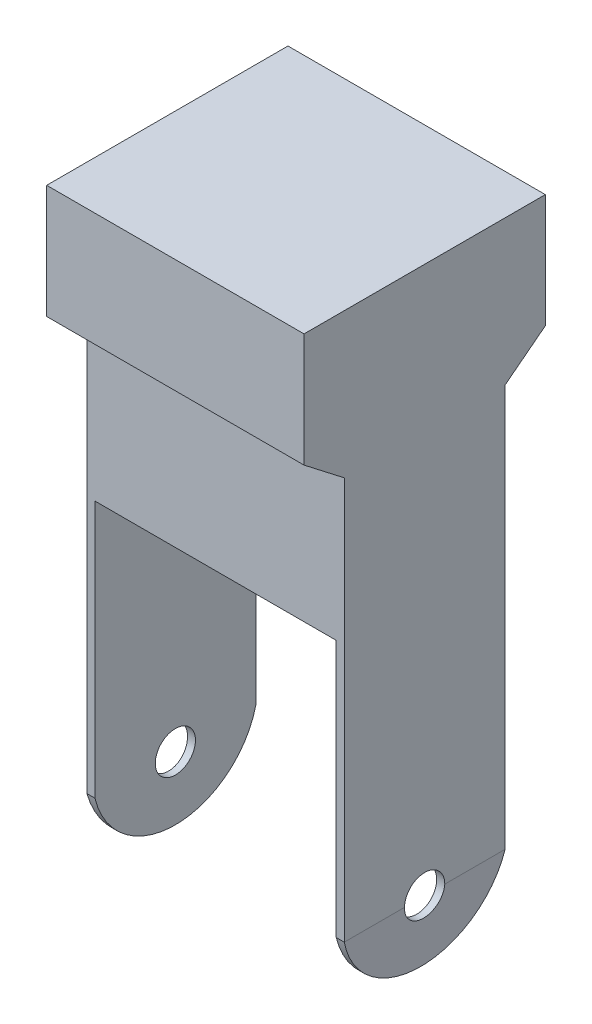
ISO-10303-21;
HEADER;
FILE_DESCRIPTION(('STEP AP214'),'2;1');
FILE_NAME('part.step','',(''),(''),'','','');
FILE_SCHEMA(('AUTOMOTIVE_DESIGN { 1 0 10303 214 1 1 1 1 }'));
ENDSEC;
DATA;
#1=APPLICATION_CONTEXT('core data for automotive mechanical design processes');
#2=APPLICATION_PROTOCOL_DEFINITION('international standard','automotive_design',2000,#1);
#3=PRODUCT_CONTEXT('',#1,'mechanical');
#4=PRODUCT('Part','Part','',(#3));
#5=PRODUCT_RELATED_PRODUCT_CATEGORY('part','',(#4));
#6=PRODUCT_DEFINITION_FORMATION('','',#4);
#7=PRODUCT_DEFINITION_CONTEXT('part definition',#1,'design');
#8=PRODUCT_DEFINITION('design','',#6,#7);
#9=PRODUCT_DEFINITION_SHAPE('','',#8);
#10=(LENGTH_UNIT() NAMED_UNIT(*) SI_UNIT(.MILLI.,.METRE.));
#11=(NAMED_UNIT(*) PLANE_ANGLE_UNIT() SI_UNIT($,.RADIAN.));
#12=(NAMED_UNIT(*) SI_UNIT($,.STERADIAN.) SOLID_ANGLE_UNIT());
#13=UNCERTAINTY_MEASURE_WITH_UNIT(LENGTH_MEASURE(1.E-05),#10,'distance_accuracy_value','');
#14=(GEOMETRIC_REPRESENTATION_CONTEXT(3) GLOBAL_UNCERTAINTY_ASSIGNED_CONTEXT((#13)) GLOBAL_UNIT_ASSIGNED_CONTEXT((#10,
#11,#12)) REPRESENTATION_CONTEXT('',''));
#15=CARTESIAN_POINT('',(0.,0.,0.));
#16=DIRECTION('',(0.,0.,1.));
#17=DIRECTION('',(1.,0.,0.));
#18=AXIS2_PLACEMENT_3D('',#15,#16,#17);
#19=CARTESIAN_POINT('',(15.5,-8.,15.));
#20=DIRECTION('',(-0.998052578482889,0.0623782861551806,0.));
#21=DIRECTION('',(-0.0623782861551806,-0.998052578482889,0.));
#22=AXIS2_PLACEMENT_3D('',#19,#20,#21);
#23=PLANE('',#22);
#24=DIRECTION('',(0.,0.,-1.));
#25=VECTOR('',#24,1.);
#26=CARTESIAN_POINT('',(16.,0.,15.));
#27=LINE('',#26,#25);
#28=CARTESIAN_POINT('',(16.,0.,10.));
#29=VERTEX_POINT('',#28);
#30=CARTESIAN_POINT('',(16.,0.,2.5));
#31=VERTEX_POINT('',#30);
#32=EDGE_CURVE('E212',#29,#31,#27,.T.);
#33=ORIENTED_EDGE('',*,*,#32,.F.);
#34=CARTESIAN_POINT('',(16.1507547878053,2.41207660488458,0.));
#35=DIRECTION('',(-0.998052578482889,0.0623782861551806,0.));
#36=DIRECTION('',(-0.0623782861551806,-0.998052578482889,0.));
#37=AXIS2_PLACEMENT_3D('',#34,#35,#36);
#38=ELLIPSE('',#37,10.3068649721376,10.2867931615169);
#39=CARTESIAN_POINT('',(16.,0.,-10.));
#40=VERTEX_POINT('',#39);
#41=EDGE_CURVE('E333',#29,#40,#38,.F.);
#42=ORIENTED_EDGE('',*,*,#41,.T.);
#43=CARTESIAN_POINT('',(16.,0.,-2.5));
#44=VERTEX_POINT('',#43);
#45=EDGE_CURVE('E208',#44,#40,#27,.T.);
#46=ORIENTED_EDGE('',*,*,#45,.F.);
#47=CARTESIAN_POINT('',(16.,0.,0.));
#48=DIRECTION('',(-0.998052578482889,0.0623782861551806,0.));
#49=DIRECTION('',(-0.0623782861551806,-0.998052578482889,0.));
#50=AXIS2_PLACEMENT_3D('',#47,#48,#49);
#51=ELLIPSE('',#50,2.50487805341897,2.5);
#52=EDGE_CURVE('E69',#44,#31,#51,.T.);
#53=ORIENTED_EDGE('',*,*,#52,.T.);
#54=EDGE_LOOP('',(#33,#42,#46,#53));
#55=FACE_BOUND('',#54,.T.);
#56=ADVANCED_FACE('F45',(#55),#23,.F.);
#57=CARTESIAN_POINT('',(16.,0.,15.));
#58=DIRECTION('',(-1.,0.,0.));
#59=DIRECTION('',(0.,0.,1.));
#60=AXIS2_PLACEMENT_3D('',#57,#58,#59);
#61=PLANE('',#60);
#62=DIRECTION('',(0.,-0.612152092307652,-0.790740043176874));
#63=VECTOR('',#62,1.);
#64=CARTESIAN_POINT('',(16.,50.,10.));
#65=LINE('',#64,#63);
#66=CARTESIAN_POINT('',(16.,53.8707543496107,15.));
#67=VERTEX_POINT('',#66);
#68=CARTESIAN_POINT('',(16.,50.,10.));
#69=VERTEX_POINT('',#68);
#70=EDGE_CURVE('E239',#67,#69,#65,.T.);
#71=ORIENTED_EDGE('',*,*,#70,.T.);
#72=DIRECTION('',(0.,-1.,0.));
#73=VECTOR('',#72,1.);
#74=CARTESIAN_POINT('',(16.,0.,10.));
#75=LINE('',#74,#73);
#76=EDGE_CURVE('E276',#69,#29,#75,.T.);
#77=ORIENTED_EDGE('',*,*,#76,.T.);
#78=ORIENTED_EDGE('',*,*,#32,.T.);
#79=CARTESIAN_POINT('',(16.,0.,0.));
#80=DIRECTION('',(-1.,0.,0.));
#81=DIRECTION('',(0.,0.,1.));
#82=AXIS2_PLACEMENT_3D('',#79,#80,#81);
#83=CIRCLE('',#82,2.5);
#84=EDGE_CURVE('E274',#31,#44,#83,.T.);
#85=ORIENTED_EDGE('',*,*,#84,.T.);
#86=ORIENTED_EDGE('',*,*,#45,.T.);
#87=DIRECTION('',(0.,1.,0.));
#88=VECTOR('',#87,1.);
#89=CARTESIAN_POINT('',(16.,0.,-10.));
#90=LINE('',#89,#88);
#91=CARTESIAN_POINT('',(16.,50.,-10.));
#92=VERTEX_POINT('',#91);
#93=EDGE_CURVE('E269',#40,#92,#90,.T.);
#94=ORIENTED_EDGE('',*,*,#93,.T.);
#95=DIRECTION('',(0.,0.612152092307652,-0.790740043176874));
#96=VECTOR('',#95,1.);
#97=CARTESIAN_POINT('',(16.,50.,-10.));
#98=LINE('',#97,#96);
#99=CARTESIAN_POINT('',(16.,53.8707543496107,-15.));
#100=VERTEX_POINT('',#99);
#101=EDGE_CURVE('E267',#92,#100,#98,.T.);
#102=ORIENTED_EDGE('',*,*,#101,.T.);
#103=DIRECTION('',(0.,1.,0.));
#104=VECTOR('',#103,1.);
#105=CARTESIAN_POINT('',(16.,0.,-15.));
#106=LINE('',#105,#104);
#107=CARTESIAN_POINT('',(16.,68.,-15.));
#108=VERTEX_POINT('',#107);
#109=EDGE_CURVE('E251',#100,#108,#106,.T.);
#110=ORIENTED_EDGE('',*,*,#109,.T.);
#111=DIRECTION('',(0.,0.,-1.));
#112=VECTOR('',#111,1.);
#113=CARTESIAN_POINT('',(16.,68.,15.));
#114=LINE('',#113,#112);
#115=CARTESIAN_POINT('',(16.,68.,15.));
#116=VERTEX_POINT('',#115);
#117=EDGE_CURVE('E204',#116,#108,#114,.T.);
#118=ORIENTED_EDGE('',*,*,#117,.F.);
#119=DIRECTION('',(0.,1.,0.));
#120=VECTOR('',#119,1.);
#121=CARTESIAN_POINT('',(16.,0.,15.));
#122=LINE('',#121,#120);
#123=EDGE_CURVE('E230',#67,#116,#122,.T.);
#124=ORIENTED_EDGE('',*,*,#123,.F.);
#125=EDGE_LOOP('',(#71,#77,#78,#85,#86,#94,#102,#110,#118,#124));
#126=FACE_BOUND('',#125,.T.);
#127=ADVANCED_FACE('F237',(#126),#61,.F.);
#128=CARTESIAN_POINT('',(-16.,68.,15.));
#129=DIRECTION('',(0.,-1.,0.));
#130=DIRECTION('',(0.,0.,-1.));
#131=AXIS2_PLACEMENT_3D('',#128,#129,#130);
#132=PLANE('',#131);
#133=DIRECTION('',(-1.,0.,0.));
#134=VECTOR('',#133,1.);
#135=CARTESIAN_POINT('',(-16.,68.,-15.));
#136=LINE('',#135,#134);
#137=CARTESIAN_POINT('',(-16.,68.,-15.));
#138=VERTEX_POINT('',#137);
#139=EDGE_CURVE('E246',#108,#138,#136,.T.);
#140=ORIENTED_EDGE('',*,*,#139,.T.);
#141=DIRECTION('',(0.,0.,-1.));
#142=VECTOR('',#141,1.);
#143=CARTESIAN_POINT('',(-16.,68.,15.));
#144=LINE('',#143,#142);
#145=CARTESIAN_POINT('',(-16.,68.,15.));
#146=VERTEX_POINT('',#145);
#147=EDGE_CURVE('E187',#146,#138,#144,.T.);
#148=ORIENTED_EDGE('',*,*,#147,.F.);
#149=DIRECTION('',(-1.,0.,0.));
#150=VECTOR('',#149,1.);
#151=CARTESIAN_POINT('',(-16.,68.,15.));
#152=LINE('',#151,#150);
#153=EDGE_CURVE('E190',#116,#146,#152,.T.);
#154=ORIENTED_EDGE('',*,*,#153,.F.);
#155=ORIENTED_EDGE('',*,*,#117,.T.);
#156=EDGE_LOOP('',(#140,#148,#154,#155));
#157=FACE_BOUND('',#156,.T.);
#158=ADVANCED_FACE('F257',(#157),#132,.F.);
#159=CARTESIAN_POINT('',(-16.,0.,15.));
#160=DIRECTION('',(1.,0.,0.));
#161=DIRECTION('',(0.,0.,-1.));
#162=AXIS2_PLACEMENT_3D('',#159,#160,#161);
#163=PLANE('',#162);
#164=DIRECTION('',(0.,0.,-1.));
#165=VECTOR('',#164,1.);
#166=CARTESIAN_POINT('',(-16.,0.,15.));
#167=LINE('',#166,#165);
#168=CARTESIAN_POINT('',(-16.000006,0.,10.));
#169=VERTEX_POINT('',#168);
#170=CARTESIAN_POINT('',(-16.,0.,2.5));
#171=VERTEX_POINT('',#170);
#172=EDGE_CURVE('E182',#169,#171,#167,.T.);
#173=ORIENTED_EDGE('',*,*,#172,.F.);
#174=DIRECTION('',(0.,1.,0.));
#175=VECTOR('',#174,1.);
#176=CARTESIAN_POINT('',(-16.,0.,10.));
#177=LINE('',#176,#175);
#178=CARTESIAN_POINT('',(-16.,50.,10.));
#179=VERTEX_POINT('',#178);
#180=EDGE_CURVE('E315',#169,#179,#177,.T.);
#181=ORIENTED_EDGE('',*,*,#180,.T.);
#182=DIRECTION('',(0.,0.612152092307652,0.790740043176874));
#183=VECTOR('',#182,1.);
#184=CARTESIAN_POINT('',(-16.,33.6837566536791,-11.0763095156915));
#185=LINE('',#184,#183);
#186=CARTESIAN_POINT('',(-16.,53.8707543496107,15.));
#187=VERTEX_POINT('',#186);
#188=EDGE_CURVE('E284',#179,#187,#185,.T.);
#189=ORIENTED_EDGE('',*,*,#188,.T.);
#190=DIRECTION('',(0.,-1.,0.));
#191=VECTOR('',#190,1.);
#192=CARTESIAN_POINT('',(-16.,0.,15.));
#193=LINE('',#192,#191);
#194=EDGE_CURVE('E183',#146,#187,#193,.T.);
#195=ORIENTED_EDGE('',*,*,#194,.F.);
#196=ORIENTED_EDGE('',*,*,#147,.T.);
#197=DIRECTION('',(0.,-1.,0.));
#198=VECTOR('',#197,1.);
#199=CARTESIAN_POINT('',(-16.,0.,-15.));
#200=LINE('',#199,#198);
#201=CARTESIAN_POINT('',(-16.,53.8707543496107,-15.));
#202=VERTEX_POINT('',#201);
#203=EDGE_CURVE('E198',#138,#202,#200,.T.);
#204=ORIENTED_EDGE('',*,*,#203,.T.);
#205=DIRECTION('',(0.,-0.612152092307652,0.790740043176874));
#206=VECTOR('',#205,1.);
#207=CARTESIAN_POINT('',(-16.,19.1621614966141,29.8344039921924));
#208=LINE('',#207,#206);
#209=CARTESIAN_POINT('',(-16.,50.,-10.));
#210=VERTEX_POINT('',#209);
#211=EDGE_CURVE('E174',#202,#210,#208,.T.);
#212=ORIENTED_EDGE('',*,*,#211,.T.);
#213=DIRECTION('',(0.,-1.,0.));
#214=VECTOR('',#213,1.);
#215=CARTESIAN_POINT('',(-16.,0.,-10.));
#216=LINE('',#215,#214);
#217=CARTESIAN_POINT('',(-16.,0.,-10.));
#218=VERTEX_POINT('',#217);
#219=EDGE_CURVE('E160',#210,#218,#216,.T.);
#220=ORIENTED_EDGE('',*,*,#219,.T.);
#221=CARTESIAN_POINT('',(-16.,0.,-2.5));
#222=VERTEX_POINT('',#221);
#223=EDGE_CURVE('E172',#222,#218,#167,.T.);
#224=ORIENTED_EDGE('',*,*,#223,.F.);
#225=CARTESIAN_POINT('',(-16.,0.,0.));
#226=DIRECTION('',(1.,0.,0.));
#227=DIRECTION('',(0.,0.,-1.));
#228=AXIS2_PLACEMENT_3D('',#225,#226,#227);
#229=CIRCLE('',#228,2.5);
#230=EDGE_CURVE('E287',#222,#171,#229,.T.);
#231=ORIENTED_EDGE('',*,*,#230,.T.);
#232=EDGE_LOOP('',(#173,#181,#189,#195,#196,#204,#212,#220,#224,#231));
#233=FACE_BOUND('',#232,.T.);
#234=ADVANCED_FACE('F170',(#233),#163,.F.);
#235=CARTESIAN_POINT('',(-15.5,-8.,15.));
#236=DIRECTION('',(0.998052578482889,0.0623782861551806,0.));
#237=DIRECTION('',(-0.0623782861551806,0.998052578482889,0.));
#238=AXIS2_PLACEMENT_3D('',#235,#236,#237);
#239=PLANE('',#238);
#240=ORIENTED_EDGE('',*,*,#223,.T.);
#241=CARTESIAN_POINT('',(-16.1507547878053,2.41207660488458,0.));
#242=DIRECTION('',(0.998052578482889,0.0623782861551806,0.));
#243=DIRECTION('',(-0.0623782861551806,0.998052578482889,0.));
#244=AXIS2_PLACEMENT_3D('',#241,#242,#243);
#245=ELLIPSE('',#244,10.3068649721376,10.2867931615169);
#246=EDGE_CURVE('E12',#218,#169,#245,.F.);
#247=ORIENTED_EDGE('',*,*,#246,.T.);
#248=ORIENTED_EDGE('',*,*,#172,.T.);
#249=CARTESIAN_POINT('',(-16.,0.,0.));
#250=DIRECTION('',(0.998052578482889,0.0623782861551806,0.));
#251=DIRECTION('',(-0.0623782861551806,0.998052578482889,0.));
#252=AXIS2_PLACEMENT_3D('',#249,#250,#251);
#253=ELLIPSE('',#252,2.50487805341897,2.5);
#254=EDGE_CURVE('E55',#171,#222,#253,.T.);
#255=ORIENTED_EDGE('',*,*,#254,.T.);
#256=EDGE_LOOP('',(#240,#247,#248,#255));
#257=FACE_BOUND('',#256,.T.);
#258=ADVANCED_FACE('F180',(#257),#239,.F.);
#259=CARTESIAN_POINT('',(0.,0.,15.));
#260=DIRECTION('',(0.,0.,-1.));
#261=DIRECTION('',(-1.,0.,0.));
#262=AXIS2_PLACEMENT_3D('',#259,#260,#261);
#263=PLANE('',#262);
#264=ORIENTED_EDGE('',*,*,#194,.T.);
#265=DIRECTION('',(1.,0.,0.));
#266=VECTOR('',#265,1.);
#267=CARTESIAN_POINT('',(0.,53.8707543496107,15.));
#268=LINE('',#267,#266);
#269=EDGE_CURVE('E223',#187,#67,#268,.T.);
#270=ORIENTED_EDGE('',*,*,#269,.T.);
#271=ORIENTED_EDGE('',*,*,#123,.T.);
#272=ORIENTED_EDGE('',*,*,#153,.T.);
#273=EDGE_LOOP('',(#264,#270,#271,#272));
#274=FACE_BOUND('',#273,.T.);
#275=ADVANCED_FACE('F229',(#274),#263,.F.);
#276=CARTESIAN_POINT('',(0.,0.,-15.));
#277=DIRECTION('',(0.,0.,-1.));
#278=DIRECTION('',(-1.,0.,0.));
#279=AXIS2_PLACEMENT_3D('',#276,#277,#278);
#280=PLANE('',#279);
#281=DIRECTION('',(1.,0.,0.));
#282=VECTOR('',#281,1.);
#283=CARTESIAN_POINT('',(0.,53.8707543496107,-15.));
#284=LINE('',#283,#282);
#285=EDGE_CURVE('E221',#202,#100,#284,.T.);
#286=ORIENTED_EDGE('',*,*,#285,.F.);
#287=ORIENTED_EDGE('',*,*,#203,.F.);
#288=ORIENTED_EDGE('',*,*,#139,.F.);
#289=ORIENTED_EDGE('',*,*,#109,.F.);
#290=EDGE_LOOP('',(#286,#287,#288,#289));
#291=FACE_BOUND('',#290,.T.);
#292=ADVANCED_FACE('F262',(#291),#280,.T.);
#293=CARTESIAN_POINT('',(16.,2.41207660488458,0.));
#294=DIRECTION('',(-1.,0.,0.));
#295=DIRECTION('',(0.,0.,1.));
#296=AXIS2_PLACEMENT_3D('',#293,#294,#295);
#297=CYLINDRICAL_SURFACE('',#296,10.2867931615169);
#298=DIRECTION('',(-1.,0.,0.));
#299=VECTOR('',#298,1.);
#300=CARTESIAN_POINT('',(16.,0.,10.));
#301=LINE('',#300,#299);
#302=CARTESIAN_POINT('',(-15.,0.,10.));
#303=VERTEX_POINT('',#302);
#304=EDGE_CURVE('E153',#303,#169,#301,.T.);
#305=ORIENTED_EDGE('',*,*,#304,.T.);
#306=ORIENTED_EDGE('',*,*,#246,.F.);
#307=DIRECTION('',(-1.,0.,0.));
#308=VECTOR('',#307,1.);
#309=CARTESIAN_POINT('',(16.,0.,-10.));
#310=LINE('',#309,#308);
#311=CARTESIAN_POINT('',(-15.,0.,-10.));
#312=VERTEX_POINT('',#311);
#313=EDGE_CURVE('E150',#312,#218,#310,.T.);
#314=ORIENTED_EDGE('',*,*,#313,.F.);
#315=CARTESIAN_POINT('',(-15.,2.41207660488458,0.));
#316=DIRECTION('',(-1.,0.,0.));
#317=DIRECTION('',(0.,0.,1.));
#318=AXIS2_PLACEMENT_3D('',#315,#316,#317);
#319=CIRCLE('',#318,10.2867931615169);
#320=EDGE_CURVE('E248',#303,#312,#319,.F.);
#321=ORIENTED_EDGE('',*,*,#320,.F.);
#322=EDGE_LOOP('',(#305,#306,#314,#321));
#323=FACE_BOUND('',#322,.T.);
#324=ADVANCED_FACE('F149',(#323),#297,.T.);
#325=CARTESIAN_POINT('',(15.,0.,-10.));
#326=VERTEX_POINT('',#325);
#327=EDGE_CURVE('E62',#40,#326,#310,.T.);
#328=ORIENTED_EDGE('',*,*,#327,.F.);
#329=ORIENTED_EDGE('',*,*,#41,.F.);
#330=CARTESIAN_POINT('',(15.,0.,10.));
#331=VERTEX_POINT('',#330);
#332=EDGE_CURVE('E307',#29,#331,#301,.T.);
#333=ORIENTED_EDGE('',*,*,#332,.T.);
#334=CARTESIAN_POINT('',(15.,2.41207660488458,0.));
#335=DIRECTION('',(1.,0.,0.));
#336=DIRECTION('',(0.,0.,-1.));
#337=AXIS2_PLACEMENT_3D('',#334,#335,#336);
#338=CIRCLE('',#337,10.2867931615169);
#339=EDGE_CURVE('E336',#326,#331,#338,.F.);
#340=ORIENTED_EDGE('',*,*,#339,.F.);
#341=EDGE_LOOP('',(#328,#329,#333,#340));
#342=FACE_BOUND('',#341,.T.);
#343=ADVANCED_FACE('F434',(#342),#297,.T.);
#344=CARTESIAN_POINT('',(16.,0.,10.));
#345=DIRECTION('',(0.,0.,-1.));
#346=DIRECTION('',(-1.,0.,0.));
#347=AXIS2_PLACEMENT_3D('',#344,#345,#346);
#348=PLANE('',#347);
#349=DIRECTION('',(-1.,0.,0.));
#350=VECTOR('',#349,1.);
#351=CARTESIAN_POINT('',(-15.,32.,10.));
#352=LINE('',#351,#350);
#353=CARTESIAN_POINT('',(15.,32.,10.));
#354=VERTEX_POINT('',#353);
#355=CARTESIAN_POINT('',(-15.,32.,10.));
#356=VERTEX_POINT('',#355);
#357=EDGE_CURVE('E325',#354,#356,#352,.T.);
#358=ORIENTED_EDGE('',*,*,#357,.F.);
#359=DIRECTION('',(0.,1.,0.));
#360=VECTOR('',#359,1.);
#361=CARTESIAN_POINT('',(15.,32.,10.));
#362=LINE('',#361,#360);
#363=EDGE_CURVE('E319',#331,#354,#362,.T.);
#364=ORIENTED_EDGE('',*,*,#363,.F.);
#365=ORIENTED_EDGE('',*,*,#332,.F.);
#366=ORIENTED_EDGE('',*,*,#76,.F.);
#367=DIRECTION('',(-1.,0.,0.));
#368=VECTOR('',#367,1.);
#369=CARTESIAN_POINT('',(16.,50.,10.));
#370=LINE('',#369,#368);
#371=EDGE_CURVE('E348',#69,#179,#370,.T.);
#372=ORIENTED_EDGE('',*,*,#371,.T.);
#373=ORIENTED_EDGE('',*,*,#180,.F.);
#374=ORIENTED_EDGE('',*,*,#304,.F.);
#375=DIRECTION('',(0.,-1.,0.));
#376=VECTOR('',#375,1.);
#377=CARTESIAN_POINT('',(-15.,-8.,10.));
#378=LINE('',#377,#376);
#379=EDGE_CURVE('E329',#356,#303,#378,.T.);
#380=ORIENTED_EDGE('',*,*,#379,.F.);
#381=EDGE_LOOP('',(#358,#364,#365,#366,#372,#373,#374,#380));
#382=FACE_BOUND('',#381,.T.);
#383=ADVANCED_FACE('F345',(#382),#348,.F.);
#384=CARTESIAN_POINT('',(16.,0.,-10.));
#385=DIRECTION('',(0.,0.,1.));
#386=DIRECTION('',(1.,0.,0.));
#387=AXIS2_PLACEMENT_3D('',#384,#385,#386);
#388=PLANE('',#387);
#389=ORIENTED_EDGE('',*,*,#313,.T.);
#390=ORIENTED_EDGE('',*,*,#219,.F.);
#391=DIRECTION('',(-1.,0.,0.));
#392=VECTOR('',#391,1.);
#393=CARTESIAN_POINT('',(16.,50.,-10.));
#394=LINE('',#393,#392);
#395=EDGE_CURVE('E165',#92,#210,#394,.T.);
#396=ORIENTED_EDGE('',*,*,#395,.F.);
#397=ORIENTED_EDGE('',*,*,#93,.F.);
#398=ORIENTED_EDGE('',*,*,#327,.T.);
#399=DIRECTION('',(0.,-1.,0.));
#400=VECTOR('',#399,1.);
#401=CARTESIAN_POINT('',(15.,32.,-10.));
#402=LINE('',#401,#400);
#403=CARTESIAN_POINT('',(15.,32.,-10.));
#404=VERTEX_POINT('',#403);
#405=EDGE_CURVE('E176',#404,#326,#402,.T.);
#406=ORIENTED_EDGE('',*,*,#405,.F.);
#407=DIRECTION('',(1.,0.,0.));
#408=VECTOR('',#407,1.);
#409=CARTESIAN_POINT('',(-15.,32.,-10.));
#410=LINE('',#409,#408);
#411=CARTESIAN_POINT('',(-15.,32.,-10.));
#412=VERTEX_POINT('',#411);
#413=EDGE_CURVE('E498',#412,#404,#410,.T.);
#414=ORIENTED_EDGE('',*,*,#413,.F.);
#415=DIRECTION('',(0.,1.,0.));
#416=VECTOR('',#415,1.);
#417=CARTESIAN_POINT('',(-15.,-8.,-10.));
#418=LINE('',#417,#416);
#419=EDGE_CURVE('E163',#312,#412,#418,.T.);
#420=ORIENTED_EDGE('',*,*,#419,.F.);
#421=EDGE_LOOP('',(#389,#390,#396,#397,#398,#406,#414,#420));
#422=FACE_BOUND('',#421,.T.);
#423=ADVANCED_FACE('F159',(#422),#388,.F.);
#424=CARTESIAN_POINT('',(16.,50.,10.));
#425=DIRECTION('',(0.,0.790740043176874,-0.612152092307652));
#426=DIRECTION('',(0.,0.612152092307652,0.790740043176874));
#427=AXIS2_PLACEMENT_3D('',#424,#425,#426);
#428=PLANE('',#427);
#429=ORIENTED_EDGE('',*,*,#371,.F.);
#430=ORIENTED_EDGE('',*,*,#70,.F.);
#431=ORIENTED_EDGE('',*,*,#269,.F.);
#432=ORIENTED_EDGE('',*,*,#188,.F.);
#433=EDGE_LOOP('',(#429,#430,#431,#432));
#434=FACE_BOUND('',#433,.T.);
#435=ADVANCED_FACE('F458',(#434),#428,.F.);
#436=CARTESIAN_POINT('',(16.,50.,-10.));
#437=DIRECTION('',(0.,0.790740043176874,0.612152092307652));
#438=DIRECTION('',(0.,-0.612152092307652,0.790740043176874));
#439=AXIS2_PLACEMENT_3D('',#436,#437,#438);
#440=PLANE('',#439);
#441=ORIENTED_EDGE('',*,*,#285,.T.);
#442=ORIENTED_EDGE('',*,*,#101,.F.);
#443=ORIENTED_EDGE('',*,*,#395,.T.);
#444=ORIENTED_EDGE('',*,*,#211,.F.);
#445=EDGE_LOOP('',(#441,#442,#443,#444));
#446=FACE_BOUND('',#445,.T.);
#447=ADVANCED_FACE('F266',(#446),#440,.F.);
#448=CARTESIAN_POINT('',(16.,0.,0.));
#449=DIRECTION('',(-1.,0.,0.));
#450=DIRECTION('',(0.,0.,1.));
#451=AXIS2_PLACEMENT_3D('',#448,#449,#450);
#452=CYLINDRICAL_SURFACE('',#451,2.5);
#453=ORIENTED_EDGE('',*,*,#254,.F.);
#454=ORIENTED_EDGE('',*,*,#230,.F.);
#455=EDGE_LOOP('',(#453,#454));
#456=FACE_BOUND('',#455,.T.);
#457=CARTESIAN_POINT('',(-15.,0.,0.));
#458=DIRECTION('',(-1.,0.,0.));
#459=DIRECTION('',(0.,0.,1.));
#460=AXIS2_PLACEMENT_3D('',#457,#458,#459);
#461=CIRCLE('',#460,2.5);
#462=CARTESIAN_POINT('',(-15.,0.,2.5));
#463=VERTEX_POINT('',#462);
#464=EDGE_CURVE('E177',#463,#463,#461,.T.);
#465=ORIENTED_EDGE('',*,*,#464,.F.);
#466=EDGE_LOOP('',(#465));
#467=FACE_BOUND('',#466,.T.);
#468=ADVANCED_FACE('F350',(#456,#467),#452,.F.);
#469=ORIENTED_EDGE('',*,*,#84,.F.);
#470=ORIENTED_EDGE('',*,*,#52,.F.);
#471=EDGE_LOOP('',(#469,#470));
#472=FACE_BOUND('',#471,.T.);
#473=CARTESIAN_POINT('',(15.,0.,0.));
#474=DIRECTION('',(1.,0.,0.));
#475=DIRECTION('',(0.,0.,-1.));
#476=AXIS2_PLACEMENT_3D('',#473,#474,#475);
#477=CIRCLE('',#476,2.5);
#478=CARTESIAN_POINT('',(15.,0.,-2.5));
#479=VERTEX_POINT('',#478);
#480=EDGE_CURVE('E292',#479,#479,#477,.T.);
#481=ORIENTED_EDGE('',*,*,#480,.F.);
#482=EDGE_LOOP('',(#481));
#483=FACE_BOUND('',#482,.T.);
#484=ADVANCED_FACE('F353',(#472,#483),#452,.F.);
#485=CARTESIAN_POINT('',(15.,32.,15.));
#486=DIRECTION('',(1.,0.,0.));
#487=DIRECTION('',(0.,0.,-1.));
#488=AXIS2_PLACEMENT_3D('',#485,#486,#487);
#489=PLANE('',#488);
#490=ORIENTED_EDGE('',*,*,#480,.T.);
#491=EDGE_LOOP('',(#490));
#492=FACE_BOUND('',#491,.T.);
#493=ORIENTED_EDGE('',*,*,#339,.T.);
#494=ORIENTED_EDGE('',*,*,#363,.T.);
#495=DIRECTION('',(0.,0.,-1.));
#496=VECTOR('',#495,1.);
#497=CARTESIAN_POINT('',(15.,32.,15.));
#498=LINE('',#497,#496);
#499=EDGE_CURVE('E213',#354,#404,#498,.T.);
#500=ORIENTED_EDGE('',*,*,#499,.T.);
#501=ORIENTED_EDGE('',*,*,#405,.T.);
#502=EDGE_LOOP('',(#493,#494,#500,#501));
#503=FACE_BOUND('',#502,.T.);
#504=ADVANCED_FACE('F362',(#492,#503),#489,.F.);
#505=CARTESIAN_POINT('',(-15.,32.,15.));
#506=DIRECTION('',(0.,1.,0.));
#507=DIRECTION('',(0.,0.,1.));
#508=AXIS2_PLACEMENT_3D('',#505,#506,#507);
#509=PLANE('',#508);
#510=ORIENTED_EDGE('',*,*,#499,.F.);
#511=ORIENTED_EDGE('',*,*,#357,.T.);
#512=DIRECTION('',(0.,0.,-1.));
#513=VECTOR('',#512,1.);
#514=CARTESIAN_POINT('',(-15.,32.,15.));
#515=LINE('',#514,#513);
#516=EDGE_CURVE('E217',#356,#412,#515,.T.);
#517=ORIENTED_EDGE('',*,*,#516,.T.);
#518=ORIENTED_EDGE('',*,*,#413,.T.);
#519=EDGE_LOOP('',(#510,#511,#517,#518));
#520=FACE_BOUND('',#519,.T.);
#521=ADVANCED_FACE('F358',(#520),#509,.F.);
#522=CARTESIAN_POINT('',(-15.,-8.,15.));
#523=DIRECTION('',(-1.,0.,0.));
#524=DIRECTION('',(0.,0.,1.));
#525=AXIS2_PLACEMENT_3D('',#522,#523,#524);
#526=PLANE('',#525);
#527=ORIENTED_EDGE('',*,*,#464,.T.);
#528=EDGE_LOOP('',(#527));
#529=FACE_BOUND('',#528,.T.);
#530=ORIENTED_EDGE('',*,*,#516,.F.);
#531=ORIENTED_EDGE('',*,*,#379,.T.);
#532=ORIENTED_EDGE('',*,*,#320,.T.);
#533=ORIENTED_EDGE('',*,*,#419,.T.);
#534=EDGE_LOOP('',(#530,#531,#532,#533));
#535=FACE_BOUND('',#534,.T.);
#536=ADVANCED_FACE('F47',(#529,#535),#526,.F.);
#537=CLOSED_SHELL('',(#56,#127,#158,#234,#258,#275,#292,#324,#343,#383,#423,#435,#447,#468,#484,
#504,#521,#536));
#538=MANIFOLD_SOLID_BREP('B2',#537);
#539=ADVANCED_BREP_SHAPE_REPRESENTATION('',(#18,#538),#14);
#540=SHAPE_DEFINITION_REPRESENTATION(#9,#539);
ENDSEC;
END-ISO-10303-21;
